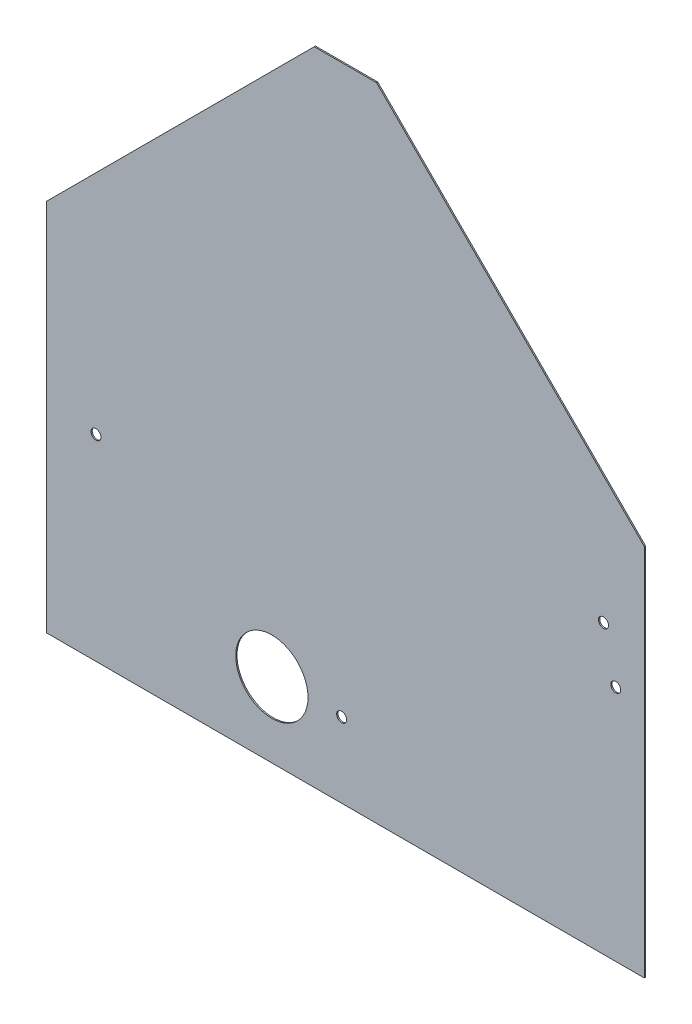
ISO-10303-21;
HEADER;
FILE_DESCRIPTION(('STEP AP214'),'2;1');
FILE_NAME('part.step','',(''),(''),'','','');
FILE_SCHEMA(('AUTOMOTIVE_DESIGN { 1 0 10303 214 1 1 1 1 }'));
ENDSEC;
DATA;
#1=APPLICATION_CONTEXT('core data for automotive mechanical design processes');
#2=APPLICATION_PROTOCOL_DEFINITION('international standard','automotive_design',2000,#1);
#3=PRODUCT_CONTEXT('',#1,'mechanical');
#4=PRODUCT('Part','Part','',(#3));
#5=PRODUCT_RELATED_PRODUCT_CATEGORY('part','',(#4));
#6=PRODUCT_DEFINITION_FORMATION('','',#4);
#7=PRODUCT_DEFINITION_CONTEXT('part definition',#1,'design');
#8=PRODUCT_DEFINITION('design','',#6,#7);
#9=PRODUCT_DEFINITION_SHAPE('','',#8);
#10=(LENGTH_UNIT() NAMED_UNIT(*) SI_UNIT(.MILLI.,.METRE.));
#11=(NAMED_UNIT(*) PLANE_ANGLE_UNIT() SI_UNIT($,.RADIAN.));
#12=(NAMED_UNIT(*) SI_UNIT($,.STERADIAN.) SOLID_ANGLE_UNIT());
#13=UNCERTAINTY_MEASURE_WITH_UNIT(LENGTH_MEASURE(1.E-05),#10,'distance_accuracy_value','');
#14=(GEOMETRIC_REPRESENTATION_CONTEXT(3) GLOBAL_UNCERTAINTY_ASSIGNED_CONTEXT((#13)) GLOBAL_UNIT_ASSIGNED_CONTEXT((#10,
#11,#12)) REPRESENTATION_CONTEXT('',''));
#15=CARTESIAN_POINT('',(0.,0.,0.));
#16=DIRECTION('',(0.,0.,1.));
#17=DIRECTION('',(1.,0.,0.));
#18=AXIS2_PLACEMENT_3D('',#15,#16,#17);
#19=CARTESIAN_POINT('',(0.,0.,1.));
#20=DIRECTION('',(0.,0.,-1.));
#21=DIRECTION('',(-1.,0.,0.));
#22=AXIS2_PLACEMENT_3D('',#19,#20,#21);
#23=PLANE('',#22);
#24=CARTESIAN_POINT('',(-46.7603318070135,184.972737386746,1.));
#25=DIRECTION('',(0.,0.,1.));
#26=DIRECTION('',(1.,0.,0.));
#27=AXIS2_PLACEMENT_3D('',#24,#25,#26);
#28=CIRCLE('',#27,4.00000000001169);
#29=CARTESIAN_POINT('',(-42.7603318070018,184.972737386746,1.));
#30=VERTEX_POINT('',#29);
#31=EDGE_CURVE('E193',#30,#30,#28,.T.);
#32=ORIENTED_EDGE('',*,*,#31,.F.);
#33=EDGE_LOOP('',(#32));
#34=FACE_BOUND('',#33,.T.);
#35=CARTESIAN_POINT('',(94.489668192995,87.1726511184606,1.));
#36=DIRECTION('',(0.,0.,1.));
#37=DIRECTION('',(1.,0.,0.));
#38=AXIS2_PLACEMENT_3D('',#35,#36,#37);
#39=CIRCLE('',#38,29.);
#40=CARTESIAN_POINT('',(123.489668192995,87.1726511184606,1.));
#41=VERTEX_POINT('',#40);
#42=EDGE_CURVE('E205',#41,#41,#39,.T.);
#43=ORIENTED_EDGE('',*,*,#42,.F.);
#44=EDGE_LOOP('',(#43));
#45=FACE_BOUND('',#44,.T.);
#46=DIRECTION('',(-0.707106781186544,0.707106781186551,0.));
#47=VECTOR('',#46,1.);
#48=CARTESIAN_POINT('',(393.489668192984,327.17265111846,1.));
#49=LINE('',#48,#47);
#50=CARTESIAN_POINT('',(393.489668192984,327.17265111846,1.));
#51=VERTEX_POINT('',#50);
#52=CARTESIAN_POINT('',(178.489668192983,542.172651118463,1.));
#53=VERTEX_POINT('',#52);
#54=EDGE_CURVE('E128',#51,#53,#49,.T.);
#55=ORIENTED_EDGE('',*,*,#54,.T.);
#56=DIRECTION('',(-1.,0.,0.));
#57=VECTOR('',#56,1.);
#58=CARTESIAN_POINT('',(128.489668192987,542.172651118463,1.));
#59=LINE('',#58,#57);
#60=CARTESIAN_POINT('',(128.489668192987,542.172651118463,1.));
#61=VERTEX_POINT('',#60);
#62=EDGE_CURVE('E86',#53,#61,#59,.T.);
#63=ORIENTED_EDGE('',*,*,#62,.T.);
#64=DIRECTION('',(-0.707106781186547,-0.707106781186548,0.));
#65=VECTOR('',#64,1.);
#66=CARTESIAN_POINT('',(-86.510331807016,327.17265111846,1.));
#67=LINE('',#66,#65);
#68=CARTESIAN_POINT('',(-86.510331807016,327.17265111846,1.));
#69=VERTEX_POINT('',#68);
#70=EDGE_CURVE('E99',#61,#69,#67,.T.);
#71=ORIENTED_EDGE('',*,*,#70,.T.);
#72=DIRECTION('',(0.,-1.,0.));
#73=VECTOR('',#72,1.);
#74=CARTESIAN_POINT('',(-86.510331807016,327.17265111846,1.));
#75=LINE('',#74,#73);
#76=CARTESIAN_POINT('',(-86.5103318070159,27.1726511184631,1.));
#77=VERTEX_POINT('',#76);
#78=EDGE_CURVE('E93',#69,#77,#75,.T.);
#79=ORIENTED_EDGE('',*,*,#78,.T.);
#80=DIRECTION('',(1.,0.,0.));
#81=VECTOR('',#80,1.);
#82=CARTESIAN_POINT('',(-86.5103318070159,27.1726511184631,1.));
#83=LINE('',#82,#81);
#84=CARTESIAN_POINT('',(393.489668192984,27.1726511184629,1.));
#85=VERTEX_POINT('',#84);
#86=EDGE_CURVE('E97',#77,#85,#83,.T.);
#87=ORIENTED_EDGE('',*,*,#86,.T.);
#88=DIRECTION('',(0.,1.,0.));
#89=VECTOR('',#88,1.);
#90=CARTESIAN_POINT('',(393.489668192984,327.17265111846,1.));
#91=LINE('',#90,#89);
#92=EDGE_CURVE('E49',#85,#51,#91,.T.);
#93=ORIENTED_EDGE('',*,*,#92,.T.);
#94=EDGE_LOOP('',(#55,#63,#71,#79,#87,#93));
#95=FACE_BOUND('',#94,.T.);
#96=CARTESIAN_POINT('',(150.489668192984,87.1726511184606,1.));
#97=DIRECTION('',(0.,0.,1.));
#98=DIRECTION('',(1.,0.,0.));
#99=AXIS2_PLACEMENT_3D('',#96,#97,#98);
#100=CIRCLE('',#99,4.00000000001489);
#101=CARTESIAN_POINT('',(154.489668192999,87.1726511184606,1.));
#102=VERTEX_POINT('',#101);
#103=EDGE_CURVE('E121',#102,#102,#100,.T.);
#104=ORIENTED_EDGE('',*,*,#103,.F.);
#105=EDGE_LOOP('',(#104));
#106=FACE_BOUND('',#105,.T.);
#107=CARTESIAN_POINT('',(360.721450059169,257.85078134404,1.));
#108=DIRECTION('',(0.,0.,1.));
#109=DIRECTION('',(1.,0.,0.));
#110=AXIS2_PLACEMENT_3D('',#107,#108,#109);
#111=CIRCLE('',#110,4.00000000001187);
#112=CARTESIAN_POINT('',(364.721450059181,257.85078134404,1.));
#113=VERTEX_POINT('',#112);
#114=EDGE_CURVE('E199',#113,#113,#111,.T.);
#115=ORIENTED_EDGE('',*,*,#114,.F.);
#116=EDGE_LOOP('',(#115));
#117=FACE_BOUND('',#116,.T.);
#118=CARTESIAN_POINT('',(370.568932328302,217.872651118474,1.));
#119=DIRECTION('',(0.,0.,1.));
#120=DIRECTION('',(1.,0.,0.));
#121=AXIS2_PLACEMENT_3D('',#118,#119,#120);
#122=CIRCLE('',#121,3.99999999999407);
#123=CARTESIAN_POINT('',(374.568932328296,217.872651118474,1.));
#124=VERTEX_POINT('',#123);
#125=EDGE_CURVE('E184',#124,#124,#122,.T.);
#126=ORIENTED_EDGE('',*,*,#125,.F.);
#127=EDGE_LOOP('',(#126));
#128=FACE_BOUND('',#127,.T.);
#129=ADVANCED_FACE('F32',(#34,#45,#95,#106,#117,#128),#23,.F.);
#130=CARTESIAN_POINT('',(0.,0.,0.));
#131=DIRECTION('',(0.,0.,-1.));
#132=DIRECTION('',(-1.,0.,0.));
#133=AXIS2_PLACEMENT_3D('',#130,#131,#132);
#134=PLANE('',#133);
#135=CARTESIAN_POINT('',(-46.7603318070135,184.972737386746,0.));
#136=DIRECTION('',(0.,0.,1.));
#137=DIRECTION('',(1.,0.,0.));
#138=AXIS2_PLACEMENT_3D('',#135,#136,#137);
#139=CIRCLE('',#138,4.00000000001169);
#140=CARTESIAN_POINT('',(-42.7603318070018,184.972737386746,0.));
#141=VERTEX_POINT('',#140);
#142=EDGE_CURVE('E190',#141,#141,#139,.T.);
#143=ORIENTED_EDGE('',*,*,#142,.T.);
#144=EDGE_LOOP('',(#143));
#145=FACE_BOUND('',#144,.T.);
#146=CARTESIAN_POINT('',(94.489668192995,87.1726511184606,0.));
#147=DIRECTION('',(0.,0.,1.));
#148=DIRECTION('',(1.,0.,0.));
#149=AXIS2_PLACEMENT_3D('',#146,#147,#148);
#150=CIRCLE('',#149,29.);
#151=CARTESIAN_POINT('',(123.489668192995,87.1726511184606,0.));
#152=VERTEX_POINT('',#151);
#153=EDGE_CURVE('E202',#152,#152,#150,.T.);
#154=ORIENTED_EDGE('',*,*,#153,.T.);
#155=EDGE_LOOP('',(#154));
#156=FACE_BOUND('',#155,.T.);
#157=DIRECTION('',(-0.707106781186544,0.707106781186551,0.));
#158=VECTOR('',#157,1.);
#159=CARTESIAN_POINT('',(393.489668192984,327.17265111846,0.));
#160=LINE('',#159,#158);
#161=CARTESIAN_POINT('',(393.489668192984,327.17265111846,0.));
#162=VERTEX_POINT('',#161);
#163=CARTESIAN_POINT('',(178.489668192983,542.172651118463,0.));
#164=VERTEX_POINT('',#163);
#165=EDGE_CURVE('E117',#162,#164,#160,.T.);
#166=ORIENTED_EDGE('',*,*,#165,.F.);
#167=DIRECTION('',(0.,1.,0.));
#168=VECTOR('',#167,1.);
#169=CARTESIAN_POINT('',(393.489668192984,327.17265111846,0.));
#170=LINE('',#169,#168);
#171=CARTESIAN_POINT('',(393.489668192984,27.1726511184629,0.));
#172=VERTEX_POINT('',#171);
#173=EDGE_CURVE('E78',#172,#162,#170,.T.);
#174=ORIENTED_EDGE('',*,*,#173,.F.);
#175=DIRECTION('',(1.,0.,0.));
#176=VECTOR('',#175,1.);
#177=CARTESIAN_POINT('',(-86.5103318070159,27.1726511184631,0.));
#178=LINE('',#177,#176);
#179=CARTESIAN_POINT('',(-86.5103318070159,27.1726511184631,0.));
#180=VERTEX_POINT('',#179);
#181=EDGE_CURVE('E72',#180,#172,#178,.T.);
#182=ORIENTED_EDGE('',*,*,#181,.F.);
#183=DIRECTION('',(0.,-1.,0.));
#184=VECTOR('',#183,1.);
#185=CARTESIAN_POINT('',(-86.510331807016,327.17265111846,0.));
#186=LINE('',#185,#184);
#187=CARTESIAN_POINT('',(-86.510331807016,327.17265111846,0.));
#188=VERTEX_POINT('',#187);
#189=EDGE_CURVE('E107',#188,#180,#186,.T.);
#190=ORIENTED_EDGE('',*,*,#189,.F.);
#191=DIRECTION('',(-0.707106781186547,-0.707106781186548,0.));
#192=VECTOR('',#191,1.);
#193=CARTESIAN_POINT('',(-86.510331807016,327.17265111846,0.));
#194=LINE('',#193,#192);
#195=CARTESIAN_POINT('',(128.489668192987,542.172651118463,0.));
#196=VERTEX_POINT('',#195);
#197=EDGE_CURVE('E123',#196,#188,#194,.T.);
#198=ORIENTED_EDGE('',*,*,#197,.F.);
#199=DIRECTION('',(-1.,0.,0.));
#200=VECTOR('',#199,1.);
#201=CARTESIAN_POINT('',(128.489668192987,542.172651118463,0.));
#202=LINE('',#201,#200);
#203=EDGE_CURVE('E120',#164,#196,#202,.T.);
#204=ORIENTED_EDGE('',*,*,#203,.F.);
#205=EDGE_LOOP('',(#166,#174,#182,#190,#198,#204));
#206=FACE_BOUND('',#205,.T.);
#207=CARTESIAN_POINT('',(150.489668192984,87.1726511184606,0.));
#208=DIRECTION('',(0.,0.,1.));
#209=DIRECTION('',(1.,0.,0.));
#210=AXIS2_PLACEMENT_3D('',#207,#208,#209);
#211=CIRCLE('',#210,4.00000000001489);
#212=CARTESIAN_POINT('',(154.489668192999,87.1726511184606,0.));
#213=VERTEX_POINT('',#212);
#214=EDGE_CURVE('E208',#213,#213,#211,.T.);
#215=ORIENTED_EDGE('',*,*,#214,.T.);
#216=EDGE_LOOP('',(#215));
#217=FACE_BOUND('',#216,.T.);
#218=CARTESIAN_POINT('',(360.721450059169,257.85078134404,0.));
#219=DIRECTION('',(0.,0.,1.));
#220=DIRECTION('',(1.,0.,0.));
#221=AXIS2_PLACEMENT_3D('',#218,#219,#220);
#222=CIRCLE('',#221,4.00000000001187);
#223=CARTESIAN_POINT('',(364.721450059181,257.85078134404,0.));
#224=VERTEX_POINT('',#223);
#225=EDGE_CURVE('E196',#224,#224,#222,.T.);
#226=ORIENTED_EDGE('',*,*,#225,.T.);
#227=EDGE_LOOP('',(#226));
#228=FACE_BOUND('',#227,.T.);
#229=CARTESIAN_POINT('',(370.568932328302,217.872651118474,0.));
#230=DIRECTION('',(0.,0.,1.));
#231=DIRECTION('',(1.,0.,0.));
#232=AXIS2_PLACEMENT_3D('',#229,#230,#231);
#233=CIRCLE('',#232,3.99999999999407);
#234=CARTESIAN_POINT('',(374.568932328296,217.872651118474,0.));
#235=VERTEX_POINT('',#234);
#236=EDGE_CURVE('E187',#235,#235,#233,.T.);
#237=ORIENTED_EDGE('',*,*,#236,.T.);
#238=EDGE_LOOP('',(#237));
#239=FACE_BOUND('',#238,.T.);
#240=ADVANCED_FACE('F137',(#145,#156,#206,#217,#228,#239),#134,.T.);
#241=CARTESIAN_POINT('',(393.489668192984,327.17265111846,1.));
#242=DIRECTION('',(-0.707106781186551,-0.707106781186544,0.));
#243=DIRECTION('',(0.707106781186544,-0.707106781186551,0.));
#244=AXIS2_PLACEMENT_3D('',#241,#242,#243);
#245=PLANE('',#244);
#246=ORIENTED_EDGE('',*,*,#165,.T.);
#247=DIRECTION('',(0.,0.,-1.));
#248=VECTOR('',#247,1.);
#249=CARTESIAN_POINT('',(178.489668192983,542.172651118463,1.));
#250=LINE('',#249,#248);
#251=EDGE_CURVE('E11',#53,#164,#250,.T.);
#252=ORIENTED_EDGE('',*,*,#251,.F.);
#253=ORIENTED_EDGE('',*,*,#54,.F.);
#254=DIRECTION('',(0.,0.,-1.));
#255=VECTOR('',#254,1.);
#256=CARTESIAN_POINT('',(393.489668192984,327.17265111846,1.));
#257=LINE('',#256,#255);
#258=EDGE_CURVE('E113',#51,#162,#257,.T.);
#259=ORIENTED_EDGE('',*,*,#258,.T.);
#260=EDGE_LOOP('',(#246,#252,#253,#259));
#261=FACE_BOUND('',#260,.T.);
#262=ADVANCED_FACE('F34',(#261),#245,.F.);
#263=CARTESIAN_POINT('',(128.489668192987,542.172651118463,1.));
#264=DIRECTION('',(0.,-1.,0.));
#265=DIRECTION('',(0.,0.,-1.));
#266=AXIS2_PLACEMENT_3D('',#263,#264,#265);
#267=PLANE('',#266);
#268=ORIENTED_EDGE('',*,*,#203,.T.);
#269=DIRECTION('',(0.,0.,-1.));
#270=VECTOR('',#269,1.);
#271=CARTESIAN_POINT('',(128.489668192987,542.172651118463,1.));
#272=LINE('',#271,#270);
#273=EDGE_CURVE('E41',#61,#196,#272,.T.);
#274=ORIENTED_EDGE('',*,*,#273,.F.);
#275=ORIENTED_EDGE('',*,*,#62,.F.);
#276=ORIENTED_EDGE('',*,*,#251,.T.);
#277=EDGE_LOOP('',(#268,#274,#275,#276));
#278=FACE_BOUND('',#277,.T.);
#279=ADVANCED_FACE('F274',(#278),#267,.F.);
#280=CARTESIAN_POINT('',(-86.510331807016,327.17265111846,1.));
#281=DIRECTION('',(0.707106781186548,-0.707106781186547,0.));
#282=DIRECTION('',(0.707106781186547,0.707106781186548,0.));
#283=AXIS2_PLACEMENT_3D('',#280,#281,#282);
#284=PLANE('',#283);
#285=ORIENTED_EDGE('',*,*,#197,.T.);
#286=DIRECTION('',(0.,0.,-1.));
#287=VECTOR('',#286,1.);
#288=CARTESIAN_POINT('',(-86.510331807016,327.17265111846,1.));
#289=LINE('',#288,#287);
#290=EDGE_CURVE('E108',#69,#188,#289,.T.);
#291=ORIENTED_EDGE('',*,*,#290,.F.);
#292=ORIENTED_EDGE('',*,*,#70,.F.);
#293=ORIENTED_EDGE('',*,*,#273,.T.);
#294=EDGE_LOOP('',(#285,#291,#292,#293));
#295=FACE_BOUND('',#294,.T.);
#296=ADVANCED_FACE('F134',(#295),#284,.F.);
#297=CARTESIAN_POINT('',(-86.510331807016,327.17265111846,1.));
#298=DIRECTION('',(1.,0.,0.));
#299=DIRECTION('',(0.,1.,0.));
#300=AXIS2_PLACEMENT_3D('',#297,#298,#299);
#301=PLANE('',#300);
#302=ORIENTED_EDGE('',*,*,#189,.T.);
#303=DIRECTION('',(0.,0.,-1.));
#304=VECTOR('',#303,1.);
#305=CARTESIAN_POINT('',(-86.5103318070159,27.1726511184631,1.));
#306=LINE('',#305,#304);
#307=EDGE_CURVE('E104',#77,#180,#306,.T.);
#308=ORIENTED_EDGE('',*,*,#307,.F.);
#309=ORIENTED_EDGE('',*,*,#78,.F.);
#310=ORIENTED_EDGE('',*,*,#290,.T.);
#311=EDGE_LOOP('',(#302,#308,#309,#310));
#312=FACE_BOUND('',#311,.T.);
#313=ADVANCED_FACE('F105',(#312),#301,.F.);
#314=CARTESIAN_POINT('',(-86.5103318070159,27.1726511184631,1.));
#315=DIRECTION('',(0.,1.,0.));
#316=DIRECTION('',(-1.,0.,0.));
#317=AXIS2_PLACEMENT_3D('',#314,#315,#316);
#318=PLANE('',#317);
#319=ORIENTED_EDGE('',*,*,#181,.T.);
#320=DIRECTION('',(0.,0.,-1.));
#321=VECTOR('',#320,1.);
#322=CARTESIAN_POINT('',(393.489668192984,27.1726511184629,1.));
#323=LINE('',#322,#321);
#324=EDGE_CURVE('E109',#85,#172,#323,.T.);
#325=ORIENTED_EDGE('',*,*,#324,.F.);
#326=ORIENTED_EDGE('',*,*,#86,.F.);
#327=ORIENTED_EDGE('',*,*,#307,.T.);
#328=EDGE_LOOP('',(#319,#325,#326,#327));
#329=FACE_BOUND('',#328,.T.);
#330=ADVANCED_FACE('F111',(#329),#318,.F.);
#331=CARTESIAN_POINT('',(393.489668192984,327.17265111846,1.));
#332=DIRECTION('',(-1.,0.,0.));
#333=DIRECTION('',(0.,-1.,0.));
#334=AXIS2_PLACEMENT_3D('',#331,#332,#333);
#335=PLANE('',#334);
#336=ORIENTED_EDGE('',*,*,#173,.T.);
#337=ORIENTED_EDGE('',*,*,#258,.F.);
#338=ORIENTED_EDGE('',*,*,#92,.F.);
#339=ORIENTED_EDGE('',*,*,#324,.T.);
#340=EDGE_LOOP('',(#336,#337,#338,#339));
#341=FACE_BOUND('',#340,.T.);
#342=ADVANCED_FACE('F142',(#341),#335,.F.);
#343=CARTESIAN_POINT('',(150.489668192984,87.1726511184606,1.));
#344=DIRECTION('',(0.,0.,-1.));
#345=DIRECTION('',(-1.,0.,0.));
#346=AXIS2_PLACEMENT_3D('',#343,#344,#345);
#347=CYLINDRICAL_SURFACE('',#346,4.00000000001489);
#348=ORIENTED_EDGE('',*,*,#103,.T.);
#349=EDGE_LOOP('',(#348));
#350=FACE_BOUND('',#349,.T.);
#351=ORIENTED_EDGE('',*,*,#214,.F.);
#352=EDGE_LOOP('',(#351));
#353=FACE_BOUND('',#352,.T.);
#354=ADVANCED_FACE('F144',(#350,#353),#347,.F.);
#355=CARTESIAN_POINT('',(94.489668192995,87.1726511184606,1.));
#356=DIRECTION('',(0.,0.,-1.));
#357=DIRECTION('',(-1.,0.,0.));
#358=AXIS2_PLACEMENT_3D('',#355,#356,#357);
#359=CYLINDRICAL_SURFACE('',#358,29.);
#360=ORIENTED_EDGE('',*,*,#42,.T.);
#361=EDGE_LOOP('',(#360));
#362=FACE_BOUND('',#361,.T.);
#363=ORIENTED_EDGE('',*,*,#153,.F.);
#364=EDGE_LOOP('',(#363));
#365=FACE_BOUND('',#364,.T.);
#366=ADVANCED_FACE('F150',(#362,#365),#359,.F.);
#367=CARTESIAN_POINT('',(360.721450059169,257.85078134404,1.));
#368=DIRECTION('',(0.,0.,-1.));
#369=DIRECTION('',(-1.,0.,0.));
#370=AXIS2_PLACEMENT_3D('',#367,#368,#369);
#371=CYLINDRICAL_SURFACE('',#370,4.00000000001187);
#372=ORIENTED_EDGE('',*,*,#114,.T.);
#373=EDGE_LOOP('',(#372));
#374=FACE_BOUND('',#373,.T.);
#375=ORIENTED_EDGE('',*,*,#225,.F.);
#376=EDGE_LOOP('',(#375));
#377=FACE_BOUND('',#376,.T.);
#378=ADVANCED_FACE('F167',(#374,#377),#371,.F.);
#379=CARTESIAN_POINT('',(-46.7603318070135,184.972737386746,1.));
#380=DIRECTION('',(0.,0.,-1.));
#381=DIRECTION('',(-1.,0.,0.));
#382=AXIS2_PLACEMENT_3D('',#379,#380,#381);
#383=CYLINDRICAL_SURFACE('',#382,4.00000000001169);
#384=ORIENTED_EDGE('',*,*,#31,.T.);
#385=EDGE_LOOP('',(#384));
#386=FACE_BOUND('',#385,.T.);
#387=ORIENTED_EDGE('',*,*,#142,.F.);
#388=EDGE_LOOP('',(#387));
#389=FACE_BOUND('',#388,.T.);
#390=ADVANCED_FACE('F171',(#386,#389),#383,.F.);
#391=CARTESIAN_POINT('',(370.568932328302,217.872651118474,1.));
#392=DIRECTION('',(0.,0.,-1.));
#393=DIRECTION('',(-1.,0.,0.));
#394=AXIS2_PLACEMENT_3D('',#391,#392,#393);
#395=CYLINDRICAL_SURFACE('',#394,3.99999999999407);
#396=ORIENTED_EDGE('',*,*,#125,.T.);
#397=EDGE_LOOP('',(#396));
#398=FACE_BOUND('',#397,.T.);
#399=ORIENTED_EDGE('',*,*,#236,.F.);
#400=EDGE_LOOP('',(#399));
#401=FACE_BOUND('',#400,.T.);
#402=ADVANCED_FACE('F175',(#398,#401),#395,.F.);
#403=CLOSED_SHELL('',(#129,#240,#262,#279,#296,#313,#330,#342,#354,#366,#378,#390,#402));
#404=MANIFOLD_SOLID_BREP('B2',#403);
#405=ADVANCED_BREP_SHAPE_REPRESENTATION('',(#18,#404),#14);
#406=SHAPE_DEFINITION_REPRESENTATION(#9,#405);
ENDSEC;
END-ISO-10303-21;
